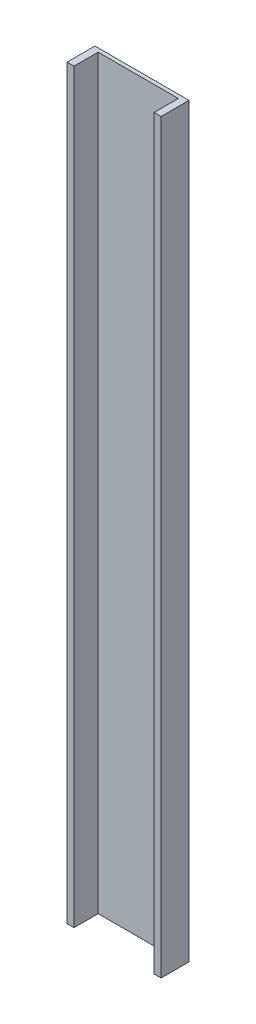
ISO-10303-21;
HEADER;
FILE_DESCRIPTION(('STEP AP214'),'2;1');
FILE_NAME('part.step','',(''),(''),'','','');
FILE_SCHEMA(('AUTOMOTIVE_DESIGN { 1 0 10303 214 1 1 1 1 }'));
ENDSEC;
DATA;
#1=APPLICATION_CONTEXT('core data for automotive mechanical design processes');
#2=APPLICATION_PROTOCOL_DEFINITION('international standard','automotive_design',2000,#1);
#3=PRODUCT_CONTEXT('',#1,'mechanical');
#4=PRODUCT('Part','Part','',(#3));
#5=PRODUCT_RELATED_PRODUCT_CATEGORY('part','',(#4));
#6=PRODUCT_DEFINITION_FORMATION('','',#4);
#7=PRODUCT_DEFINITION_CONTEXT('part definition',#1,'design');
#8=PRODUCT_DEFINITION('design','',#6,#7);
#9=PRODUCT_DEFINITION_SHAPE('','',#8);
#10=(LENGTH_UNIT() NAMED_UNIT(*) SI_UNIT(.MILLI.,.METRE.));
#11=(NAMED_UNIT(*) PLANE_ANGLE_UNIT() SI_UNIT($,.RADIAN.));
#12=(NAMED_UNIT(*) SI_UNIT($,.STERADIAN.) SOLID_ANGLE_UNIT());
#13=UNCERTAINTY_MEASURE_WITH_UNIT(LENGTH_MEASURE(1.E-05),#10,'distance_accuracy_value','');
#14=(GEOMETRIC_REPRESENTATION_CONTEXT(3) GLOBAL_UNCERTAINTY_ASSIGNED_CONTEXT((#13)) GLOBAL_UNIT_ASSIGNED_CONTEXT((#10,
#11,#12)) REPRESENTATION_CONTEXT('',''));
#15=CARTESIAN_POINT('',(0.,0.,0.));
#16=DIRECTION('',(0.,0.,1.));
#17=DIRECTION('',(1.,0.,0.));
#18=AXIS2_PLACEMENT_3D('',#15,#16,#17);
#19=CARTESIAN_POINT('',(-8.49999999999999,214.,3.99999999999999));
#20=DIRECTION('',(1.,0.,0.));
#21=DIRECTION('',(0.,0.,-1.));
#22=AXIS2_PLACEMENT_3D('',#19,#20,#21);
#23=PLANE('',#22);
#24=DIRECTION('',(0.,0.,1.));
#25=VECTOR('',#24,1.);
#26=CARTESIAN_POINT('',(-8.49999999999999,0.,3.99999999999999));
#27=LINE('',#26,#25);
#28=CARTESIAN_POINT('',(-8.49999999999999,0.,-4.00000000000001));
#29=VERTEX_POINT('',#28);
#30=CARTESIAN_POINT('',(-8.49999999999999,0.,3.99999999999999));
#31=VERTEX_POINT('',#30);
#32=EDGE_CURVE('E127',#29,#31,#27,.T.);
#33=ORIENTED_EDGE('',*,*,#32,.T.);
#34=DIRECTION('',(0.,-1.,0.));
#35=VECTOR('',#34,1.);
#36=CARTESIAN_POINT('',(-8.49999999999999,214.,3.99999999999999));
#37=LINE('',#36,#35);
#38=CARTESIAN_POINT('',(-8.49999999999999,214.,3.99999999999999));
#39=VERTEX_POINT('',#38);
#40=EDGE_CURVE('E11',#39,#31,#37,.T.);
#41=ORIENTED_EDGE('',*,*,#40,.F.);
#42=DIRECTION('',(0.,0.,1.));
#43=VECTOR('',#42,1.);
#44=CARTESIAN_POINT('',(-8.49999999999999,214.,3.99999999999999));
#45=LINE('',#44,#43);
#46=CARTESIAN_POINT('',(-8.49999999999999,214.,-4.00000000000001));
#47=VERTEX_POINT('',#46);
#48=EDGE_CURVE('E141',#47,#39,#45,.T.);
#49=ORIENTED_EDGE('',*,*,#48,.F.);
#50=DIRECTION('',(0.,-1.,0.));
#51=VECTOR('',#50,1.);
#52=CARTESIAN_POINT('',(-8.49999999999999,214.,-4.00000000000001));
#53=LINE('',#52,#51);
#54=EDGE_CURVE('E123',#47,#29,#53,.T.);
#55=ORIENTED_EDGE('',*,*,#54,.T.);
#56=EDGE_LOOP('',(#33,#41,#49,#55));
#57=FACE_BOUND('',#56,.T.);
#58=ADVANCED_FACE('F31',(#57),#23,.F.);
#59=CARTESIAN_POINT('',(-6.5,214.,3.99999999999999));
#60=DIRECTION('',(0.,0.,-1.));
#61=DIRECTION('',(-1.,0.,0.));
#62=AXIS2_PLACEMENT_3D('',#59,#60,#61);
#63=PLANE('',#62);
#64=DIRECTION('',(1.,0.,0.));
#65=VECTOR('',#64,1.);
#66=CARTESIAN_POINT('',(-6.5,0.,3.99999999999999));
#67=LINE('',#66,#65);
#68=CARTESIAN_POINT('',(-6.5,0.,3.99999999999999));
#69=VERTEX_POINT('',#68);
#70=EDGE_CURVE('E130',#31,#69,#67,.T.);
#71=ORIENTED_EDGE('',*,*,#70,.T.);
#72=DIRECTION('',(0.,-1.,0.));
#73=VECTOR('',#72,1.);
#74=CARTESIAN_POINT('',(-6.5,214.,3.99999999999999));
#75=LINE('',#74,#73);
#76=CARTESIAN_POINT('',(-6.5,214.,3.99999999999999));
#77=VERTEX_POINT('',#76);
#78=EDGE_CURVE('E39',#77,#69,#75,.T.);
#79=ORIENTED_EDGE('',*,*,#78,.F.);
#80=DIRECTION('',(1.,0.,0.));
#81=VECTOR('',#80,1.);
#82=CARTESIAN_POINT('',(-6.5,214.,3.99999999999999));
#83=LINE('',#82,#81);
#84=EDGE_CURVE('E90',#39,#77,#83,.T.);
#85=ORIENTED_EDGE('',*,*,#84,.F.);
#86=ORIENTED_EDGE('',*,*,#40,.T.);
#87=EDGE_LOOP('',(#71,#79,#85,#86));
#88=FACE_BOUND('',#87,.T.);
#89=ADVANCED_FACE('F176',(#88),#63,.F.);
#90=CARTESIAN_POINT('',(-6.5,214.,3.99999999999999));
#91=DIRECTION('',(-1.,0.,0.));
#92=DIRECTION('',(0.,0.,1.));
#93=AXIS2_PLACEMENT_3D('',#90,#91,#92);
#94=PLANE('',#93);
#95=DIRECTION('',(0.,0.,-1.));
#96=VECTOR('',#95,1.);
#97=CARTESIAN_POINT('',(-6.5,0.,3.99999999999999));
#98=LINE('',#97,#96);
#99=CARTESIAN_POINT('',(-6.5,0.,-2.93875637481425));
#100=VERTEX_POINT('',#99);
#101=EDGE_CURVE('E132',#69,#100,#98,.T.);
#102=ORIENTED_EDGE('',*,*,#101,.T.);
#103=DIRECTION('',(0.,-1.,0.));
#104=VECTOR('',#103,1.);
#105=CARTESIAN_POINT('',(-6.5,214.,-2.93875637481425));
#106=LINE('',#105,#104);
#107=CARTESIAN_POINT('',(-6.5,214.,-2.93875637481425));
#108=VERTEX_POINT('',#107);
#109=EDGE_CURVE('E148',#108,#100,#106,.T.);
#110=ORIENTED_EDGE('',*,*,#109,.F.);
#111=DIRECTION('',(0.,0.,-1.));
#112=VECTOR('',#111,1.);
#113=CARTESIAN_POINT('',(-6.5,214.,3.99999999999999));
#114=LINE('',#113,#112);
#115=EDGE_CURVE('E156',#77,#108,#114,.T.);
#116=ORIENTED_EDGE('',*,*,#115,.F.);
#117=ORIENTED_EDGE('',*,*,#78,.T.);
#118=EDGE_LOOP('',(#102,#110,#116,#117));
#119=FACE_BOUND('',#118,.T.);
#120=ADVANCED_FACE('F154',(#119),#94,.F.);
#121=CARTESIAN_POINT('',(-6.5,214.,-2.93875637481425));
#122=DIRECTION('',(0.,0.,-1.));
#123=DIRECTION('',(-1.,0.,0.));
#124=AXIS2_PLACEMENT_3D('',#121,#122,#123);
#125=PLANE('',#124);
#126=DIRECTION('',(1.,0.,0.));
#127=VECTOR('',#126,1.);
#128=CARTESIAN_POINT('',(-6.5,0.,-2.93875637481425));
#129=LINE('',#128,#127);
#130=CARTESIAN_POINT('',(16.5,0.,-2.93875637481425));
#131=VERTEX_POINT('',#130);
#132=EDGE_CURVE('E134',#100,#131,#129,.T.);
#133=ORIENTED_EDGE('',*,*,#132,.T.);
#134=DIRECTION('',(0.,-1.,0.));
#135=VECTOR('',#134,1.);
#136=CARTESIAN_POINT('',(16.5,214.,-2.93875637481425));
#137=LINE('',#136,#135);
#138=CARTESIAN_POINT('',(16.5,214.,-2.93875637481425));
#139=VERTEX_POINT('',#138);
#140=EDGE_CURVE('E145',#139,#131,#137,.T.);
#141=ORIENTED_EDGE('',*,*,#140,.F.);
#142=DIRECTION('',(1.,0.,0.));
#143=VECTOR('',#142,1.);
#144=CARTESIAN_POINT('',(-6.5,214.,-2.93875637481425));
#145=LINE('',#144,#143);
#146=EDGE_CURVE('E168',#108,#139,#145,.T.);
#147=ORIENTED_EDGE('',*,*,#146,.F.);
#148=ORIENTED_EDGE('',*,*,#109,.T.);
#149=EDGE_LOOP('',(#133,#141,#147,#148));
#150=FACE_BOUND('',#149,.T.);
#151=ADVANCED_FACE('F164',(#150),#125,.F.);
#152=CARTESIAN_POINT('',(16.5,214.,-2.93875637481425));
#153=DIRECTION('',(1.,0.,0.));
#154=DIRECTION('',(0.,0.,-1.));
#155=AXIS2_PLACEMENT_3D('',#152,#153,#154);
#156=PLANE('',#155);
#157=DIRECTION('',(0.,0.,1.));
#158=VECTOR('',#157,1.);
#159=CARTESIAN_POINT('',(16.5,0.,-2.93875637481425));
#160=LINE('',#159,#158);
#161=CARTESIAN_POINT('',(16.5,0.,3.99999999999998));
#162=VERTEX_POINT('',#161);
#163=EDGE_CURVE('E136',#131,#162,#160,.T.);
#164=ORIENTED_EDGE('',*,*,#163,.T.);
#165=DIRECTION('',(0.,-1.,0.));
#166=VECTOR('',#165,1.);
#167=CARTESIAN_POINT('',(16.5,214.,3.99999999999998));
#168=LINE('',#167,#166);
#169=CARTESIAN_POINT('',(16.5,214.,3.99999999999998));
#170=VERTEX_POINT('',#169);
#171=EDGE_CURVE('E118',#170,#162,#168,.T.);
#172=ORIENTED_EDGE('',*,*,#171,.F.);
#173=DIRECTION('',(0.,0.,1.));
#174=VECTOR('',#173,1.);
#175=CARTESIAN_POINT('',(16.5,214.,-2.93875637481425));
#176=LINE('',#175,#174);
#177=EDGE_CURVE('E109',#139,#170,#176,.T.);
#178=ORIENTED_EDGE('',*,*,#177,.F.);
#179=ORIENTED_EDGE('',*,*,#140,.T.);
#180=EDGE_LOOP('',(#164,#172,#178,#179));
#181=FACE_BOUND('',#180,.T.);
#182=ADVANCED_FACE('F167',(#181),#156,.F.);
#183=CARTESIAN_POINT('',(18.5,214.,3.99999999999998));
#184=DIRECTION('',(0.,0.,-1.));
#185=DIRECTION('',(-1.,0.,0.));
#186=AXIS2_PLACEMENT_3D('',#183,#184,#185);
#187=PLANE('',#186);
#188=DIRECTION('',(1.,0.,0.));
#189=VECTOR('',#188,1.);
#190=CARTESIAN_POINT('',(18.5,0.,3.99999999999998));
#191=LINE('',#190,#189);
#192=CARTESIAN_POINT('',(18.5,0.,3.99999999999998));
#193=VERTEX_POINT('',#192);
#194=EDGE_CURVE('E117',#162,#193,#191,.T.);
#195=ORIENTED_EDGE('',*,*,#194,.T.);
#196=DIRECTION('',(0.,-1.,0.));
#197=VECTOR('',#196,1.);
#198=CARTESIAN_POINT('',(18.5,214.,3.99999999999998));
#199=LINE('',#198,#197);
#200=CARTESIAN_POINT('',(18.5,214.,3.99999999999998));
#201=VERTEX_POINT('',#200);
#202=EDGE_CURVE('E114',#201,#193,#199,.T.);
#203=ORIENTED_EDGE('',*,*,#202,.F.);
#204=DIRECTION('',(1.,0.,0.));
#205=VECTOR('',#204,1.);
#206=CARTESIAN_POINT('',(18.5,214.,3.99999999999998));
#207=LINE('',#206,#205);
#208=EDGE_CURVE('E103',#170,#201,#207,.T.);
#209=ORIENTED_EDGE('',*,*,#208,.F.);
#210=ORIENTED_EDGE('',*,*,#171,.T.);
#211=EDGE_LOOP('',(#195,#203,#209,#210));
#212=FACE_BOUND('',#211,.T.);
#213=ADVANCED_FACE('F115',(#212),#187,.F.);
#214=CARTESIAN_POINT('',(18.5,214.,3.99999999999998));
#215=DIRECTION('',(-1.,0.,0.));
#216=DIRECTION('',(0.,0.,1.));
#217=AXIS2_PLACEMENT_3D('',#214,#215,#216);
#218=PLANE('',#217);
#219=DIRECTION('',(0.,0.,-1.));
#220=VECTOR('',#219,1.);
#221=CARTESIAN_POINT('',(18.5,0.,3.99999999999998));
#222=LINE('',#221,#220);
#223=CARTESIAN_POINT('',(18.5,0.,-4.00000000000002));
#224=VERTEX_POINT('',#223);
#225=EDGE_CURVE('E76',#193,#224,#222,.T.);
#226=ORIENTED_EDGE('',*,*,#225,.T.);
#227=DIRECTION('',(0.,-1.,0.));
#228=VECTOR('',#227,1.);
#229=CARTESIAN_POINT('',(18.5,214.,-4.00000000000002));
#230=LINE('',#229,#228);
#231=CARTESIAN_POINT('',(18.5,214.,-4.00000000000002));
#232=VERTEX_POINT('',#231);
#233=EDGE_CURVE('E119',#232,#224,#230,.T.);
#234=ORIENTED_EDGE('',*,*,#233,.F.);
#235=DIRECTION('',(0.,0.,-1.));
#236=VECTOR('',#235,1.);
#237=CARTESIAN_POINT('',(18.5,214.,3.99999999999998));
#238=LINE('',#237,#236);
#239=EDGE_CURVE('E107',#201,#232,#238,.T.);
#240=ORIENTED_EDGE('',*,*,#239,.F.);
#241=ORIENTED_EDGE('',*,*,#202,.T.);
#242=EDGE_LOOP('',(#226,#234,#240,#241));
#243=FACE_BOUND('',#242,.T.);
#244=ADVANCED_FACE('F121',(#243),#218,.F.);
#245=CARTESIAN_POINT('',(18.5,214.,-4.00000000000002));
#246=DIRECTION('',(0.,0.,1.));
#247=DIRECTION('',(1.,0.,0.));
#248=AXIS2_PLACEMENT_3D('',#245,#246,#247);
#249=PLANE('',#248);
#250=DIRECTION('',(-1.,0.,0.));
#251=VECTOR('',#250,1.);
#252=CARTESIAN_POINT('',(18.5,0.,-4.00000000000002));
#253=LINE('',#252,#251);
#254=EDGE_CURVE('E82',#224,#29,#253,.T.);
#255=ORIENTED_EDGE('',*,*,#254,.T.);
#256=ORIENTED_EDGE('',*,*,#54,.F.);
#257=DIRECTION('',(-1.,0.,0.));
#258=VECTOR('',#257,1.);
#259=CARTESIAN_POINT('',(18.5,214.,-4.00000000000002));
#260=LINE('',#259,#258);
#261=EDGE_CURVE('E47',#232,#47,#260,.T.);
#262=ORIENTED_EDGE('',*,*,#261,.F.);
#263=ORIENTED_EDGE('',*,*,#233,.T.);
#264=EDGE_LOOP('',(#255,#256,#262,#263));
#265=FACE_BOUND('',#264,.T.);
#266=ADVANCED_FACE('F192',(#265),#249,.F.);
#267=CARTESIAN_POINT('',(-8.49999999999999,214.,-4.00000000000001));
#268=DIRECTION('',(0.,1.,0.));
#269=DIRECTION('',(0.,0.,1.));
#270=AXIS2_PLACEMENT_3D('',#267,#268,#269);
#271=PLANE('',#270);
#272=ORIENTED_EDGE('',*,*,#48,.T.);
#273=ORIENTED_EDGE('',*,*,#84,.T.);
#274=ORIENTED_EDGE('',*,*,#115,.T.);
#275=ORIENTED_EDGE('',*,*,#146,.T.);
#276=ORIENTED_EDGE('',*,*,#177,.T.);
#277=ORIENTED_EDGE('',*,*,#208,.T.);
#278=ORIENTED_EDGE('',*,*,#239,.T.);
#279=ORIENTED_EDGE('',*,*,#261,.T.);
#280=EDGE_LOOP('',(#272,#273,#274,#275,#276,#277,#278,#279));
#281=FACE_BOUND('',#280,.T.);
#282=ADVANCED_FACE('F105',(#281),#271,.T.);
#283=CARTESIAN_POINT('',(-8.49999999999999,0.,-4.00000000000001));
#284=DIRECTION('',(0.,1.,0.));
#285=DIRECTION('',(0.,0.,1.));
#286=AXIS2_PLACEMENT_3D('',#283,#284,#285);
#287=PLANE('',#286);
#288=ORIENTED_EDGE('',*,*,#32,.F.);
#289=ORIENTED_EDGE('',*,*,#254,.F.);
#290=ORIENTED_EDGE('',*,*,#225,.F.);
#291=ORIENTED_EDGE('',*,*,#194,.F.);
#292=ORIENTED_EDGE('',*,*,#163,.F.);
#293=ORIENTED_EDGE('',*,*,#132,.F.);
#294=ORIENTED_EDGE('',*,*,#101,.F.);
#295=ORIENTED_EDGE('',*,*,#70,.F.);
#296=EDGE_LOOP('',(#288,#289,#290,#291,#292,#293,#294,#295));
#297=FACE_BOUND('',#296,.T.);
#298=ADVANCED_FACE('F160',(#297),#287,.F.);
#299=CLOSED_SHELL('',(#58,#89,#120,#151,#182,#213,#244,#266,#282,#298));
#300=MANIFOLD_SOLID_BREP('B2',#299);
#301=ADVANCED_BREP_SHAPE_REPRESENTATION('',(#18,#300),#14);
#302=SHAPE_DEFINITION_REPRESENTATION(#9,#301);
ENDSEC;
END-ISO-10303-21;
